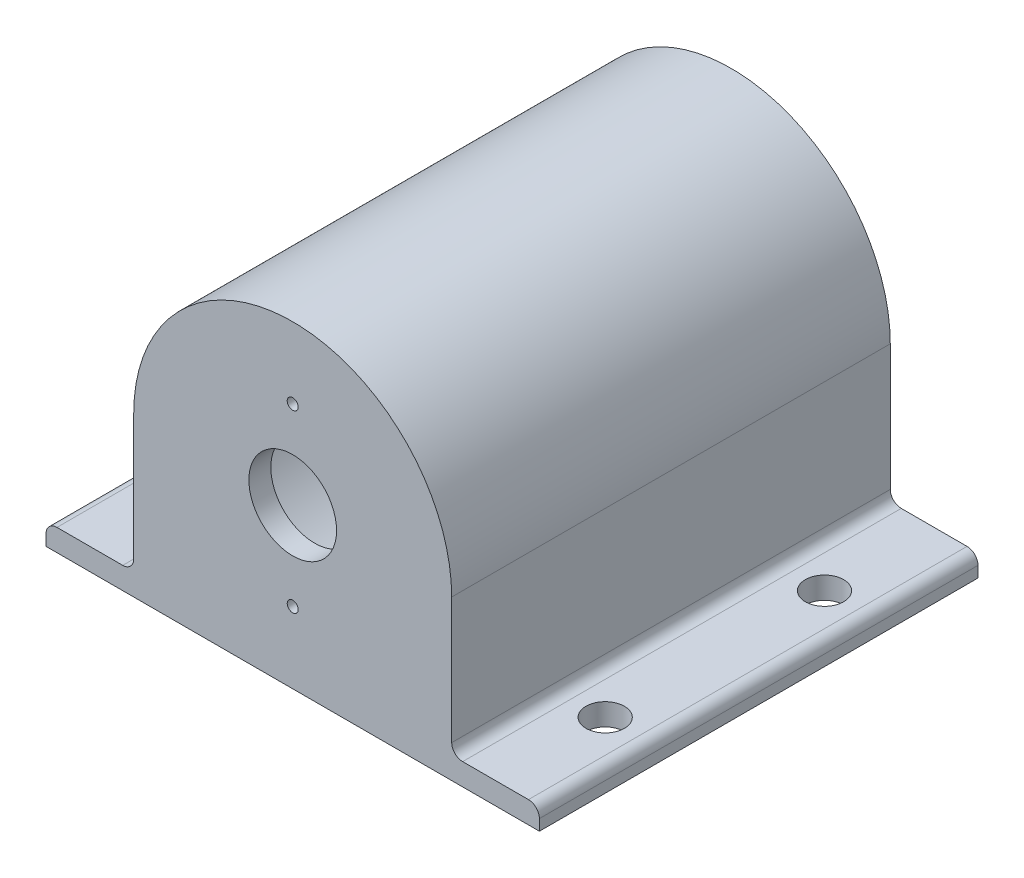
ISO-10303-21;
HEADER;
FILE_DESCRIPTION(('STEP AP214'),'2;1');
FILE_NAME('part.step','',(''),(''),'','','');
FILE_SCHEMA(('AUTOMOTIVE_DESIGN { 1 0 10303 214 1 1 1 1 }'));
ENDSEC;
DATA;
#1=APPLICATION_CONTEXT('core data for automotive mechanical design processes');
#2=APPLICATION_PROTOCOL_DEFINITION('international standard','automotive_design',2000,#1);
#3=PRODUCT_CONTEXT('',#1,'mechanical');
#4=PRODUCT('Part','Part','',(#3));
#5=PRODUCT_RELATED_PRODUCT_CATEGORY('part','',(#4));
#6=PRODUCT_DEFINITION_FORMATION('','',#4);
#7=PRODUCT_DEFINITION_CONTEXT('part definition',#1,'design');
#8=PRODUCT_DEFINITION('design','',#6,#7);
#9=PRODUCT_DEFINITION_SHAPE('','',#8);
#10=(LENGTH_UNIT() NAMED_UNIT(*) SI_UNIT(.MILLI.,.METRE.));
#11=(NAMED_UNIT(*) PLANE_ANGLE_UNIT() SI_UNIT($,.RADIAN.));
#12=(NAMED_UNIT(*) SI_UNIT($,.STERADIAN.) SOLID_ANGLE_UNIT());
#13=UNCERTAINTY_MEASURE_WITH_UNIT(LENGTH_MEASURE(1.E-05),#10,'distance_accuracy_value','');
#14=(GEOMETRIC_REPRESENTATION_CONTEXT(3) GLOBAL_UNCERTAINTY_ASSIGNED_CONTEXT((#13)) GLOBAL_UNIT_ASSIGNED_CONTEXT((#10,
#11,#12)) REPRESENTATION_CONTEXT('',''));
#15=CARTESIAN_POINT('',(0.,0.,0.));
#16=DIRECTION('',(0.,0.,1.));
#17=DIRECTION('',(1.,0.,0.));
#18=AXIS2_PLACEMENT_3D('',#15,#16,#17);
#19=CARTESIAN_POINT('',(-22.5,-14.5,0.));
#20=DIRECTION('',(0.,-1.,0.));
#21=DIRECTION('',(0.,0.,-1.));
#22=AXIS2_PLACEMENT_3D('',#19,#20,#21);
#23=PLANE('',#22);
#24=CARTESIAN_POINT('',(18.5,-14.5,30.));
#25=DIRECTION('',(0.,1.,0.));
#26=DIRECTION('',(-1.,0.,0.));
#27=AXIS2_PLACEMENT_3D('',#24,#25,#26);
#28=CIRCLE('',#27,1.75);
#29=CARTESIAN_POINT('',(16.75,-14.5,30.));
#30=VERTEX_POINT('',#29);
#31=EDGE_CURVE('E510',#30,#30,#28,.F.);
#32=ORIENTED_EDGE('',*,*,#31,.F.);
#33=EDGE_LOOP('',(#32));
#34=FACE_BOUND('',#33,.T.);
#35=CARTESIAN_POINT('',(-18.5,-14.5,30.));
#36=DIRECTION('',(0.,1.,0.));
#37=DIRECTION('',(-1.,0.,0.));
#38=AXIS2_PLACEMENT_3D('',#35,#36,#37);
#39=CIRCLE('',#38,1.75);
#40=CARTESIAN_POINT('',(-20.25,-14.5,30.));
#41=VERTEX_POINT('',#40);
#42=EDGE_CURVE('E502',#41,#41,#39,.T.);
#43=ORIENTED_EDGE('',*,*,#42,.T.);
#44=EDGE_LOOP('',(#43));
#45=FACE_BOUND('',#44,.T.);
#46=CARTESIAN_POINT('',(-18.5,-14.5,10.));
#47=DIRECTION('',(0.,1.,0.));
#48=DIRECTION('',(-1.,0.,0.));
#49=AXIS2_PLACEMENT_3D('',#46,#47,#48);
#50=CIRCLE('',#49,1.75);
#51=CARTESIAN_POINT('',(-20.25,-14.5,10.));
#52=VERTEX_POINT('',#51);
#53=EDGE_CURVE('E172',#52,#52,#50,.T.);
#54=ORIENTED_EDGE('',*,*,#53,.T.);
#55=EDGE_LOOP('',(#54));
#56=FACE_BOUND('',#55,.T.);
#57=DIRECTION('',(1.,0.,0.));
#58=VECTOR('',#57,1.);
#59=CARTESIAN_POINT('',(-22.5,-14.5,40.));
#60=LINE('',#59,#58);
#61=CARTESIAN_POINT('',(-22.5,-14.5,40.));
#62=VERTEX_POINT('',#61);
#63=CARTESIAN_POINT('',(22.5,-14.5,40.));
#64=VERTEX_POINT('',#63);
#65=EDGE_CURVE('E158',#62,#64,#60,.T.);
#66=ORIENTED_EDGE('',*,*,#65,.F.);
#67=DIRECTION('',(0.,0.,1.));
#68=VECTOR('',#67,1.);
#69=CARTESIAN_POINT('',(-22.5,-14.5,0.));
#70=LINE('',#69,#68);
#71=CARTESIAN_POINT('',(-22.5,-14.5,0.));
#72=VERTEX_POINT('',#71);
#73=EDGE_CURVE('E146',#72,#62,#70,.T.);
#74=ORIENTED_EDGE('',*,*,#73,.F.);
#75=DIRECTION('',(1.,0.,0.));
#76=VECTOR('',#75,1.);
#77=CARTESIAN_POINT('',(-22.5,-14.5,0.));
#78=LINE('',#77,#76);
#79=CARTESIAN_POINT('',(22.5,-14.5,0.));
#80=VERTEX_POINT('',#79);
#81=EDGE_CURVE('E151',#72,#80,#78,.T.);
#82=ORIENTED_EDGE('',*,*,#81,.T.);
#83=DIRECTION('',(0.,0.,1.));
#84=VECTOR('',#83,1.);
#85=CARTESIAN_POINT('',(22.5,-14.5,0.));
#86=LINE('',#85,#84);
#87=EDGE_CURVE('E159',#80,#64,#86,.T.);
#88=ORIENTED_EDGE('',*,*,#87,.T.);
#89=EDGE_LOOP('',(#66,#74,#82,#88));
#90=FACE_BOUND('',#89,.T.);
#91=CARTESIAN_POINT('',(18.5,-14.5,10.));
#92=DIRECTION('',(0.,1.,0.));
#93=DIRECTION('',(-1.,0.,0.));
#94=AXIS2_PLACEMENT_3D('',#91,#92,#93);
#95=CIRCLE('',#94,1.75);
#96=CARTESIAN_POINT('',(16.75,-14.5,10.));
#97=VERTEX_POINT('',#96);
#98=EDGE_CURVE('E489',#97,#97,#95,.F.);
#99=ORIENTED_EDGE('',*,*,#98,.F.);
#100=EDGE_LOOP('',(#99));
#101=FACE_BOUND('',#100,.T.);
#102=ADVANCED_FACE('F56',(#34,#45,#56,#90,#101),#23,.T.);
#103=CARTESIAN_POINT('',(0.,0.,40.));
#104=DIRECTION('',(0.,0.,-1.));
#105=DIRECTION('',(-1.,0.,0.));
#106=AXIS2_PLACEMENT_3D('',#103,#104,#105);
#107=CYLINDRICAL_SURFACE('',#106,12.5);
#108=CARTESIAN_POINT('',(0.,0.,38.));
#109=DIRECTION('',(0.,0.,1.));
#110=DIRECTION('',(1.,0.,0.));
#111=AXIS2_PLACEMENT_3D('',#108,#109,#110);
#112=CIRCLE('',#111,12.5);
#113=CARTESIAN_POINT('',(12.5,0.,38.));
#114=VERTEX_POINT('',#113);
#115=EDGE_CURVE('E190',#114,#114,#112,.F.);
#116=ORIENTED_EDGE('',*,*,#115,.F.);
#117=EDGE_LOOP('',(#116));
#118=FACE_BOUND('',#117,.T.);
#119=CARTESIAN_POINT('',(0.,0.,0.));
#120=DIRECTION('',(0.,0.,1.));
#121=DIRECTION('',(1.,0.,0.));
#122=AXIS2_PLACEMENT_3D('',#119,#120,#121);
#123=CIRCLE('',#122,12.5);
#124=CARTESIAN_POINT('',(12.5,0.,0.));
#125=VERTEX_POINT('',#124);
#126=EDGE_CURVE('E213',#125,#125,#123,.T.);
#127=ORIENTED_EDGE('',*,*,#126,.F.);
#128=EDGE_LOOP('',(#127));
#129=FACE_BOUND('',#128,.T.);
#130=ADVANCED_FACE('F310',(#118,#129),#107,.F.);
#131=CARTESIAN_POINT('',(0.,0.,40.));
#132=DIRECTION('',(0.,0.,-1.));
#133=DIRECTION('',(-1.,0.,0.));
#134=AXIS2_PLACEMENT_3D('',#131,#132,#133);
#135=CYLINDRICAL_SURFACE('',#134,14.5);
#136=CARTESIAN_POINT('',(0.,0.,0.));
#137=DIRECTION('',(0.,0.,1.));
#138=DIRECTION('',(1.,0.,0.));
#139=AXIS2_PLACEMENT_3D('',#136,#137,#138);
#140=CIRCLE('',#139,14.5);
#141=CARTESIAN_POINT('',(14.5,0.,0.));
#142=VERTEX_POINT('',#141);
#143=CARTESIAN_POINT('',(-14.5,0.,0.));
#144=VERTEX_POINT('',#143);
#145=EDGE_CURVE('E208',#142,#144,#140,.T.);
#146=ORIENTED_EDGE('',*,*,#145,.T.);
#147=DIRECTION('',(0.,0.,-1.));
#148=VECTOR('',#147,1.);
#149=CARTESIAN_POINT('',(-14.5,0.,40.));
#150=LINE('',#149,#148);
#151=CARTESIAN_POINT('',(-14.5,0.,40.));
#152=VERTEX_POINT('',#151);
#153=EDGE_CURVE('E212',#152,#144,#150,.T.);
#154=ORIENTED_EDGE('',*,*,#153,.F.);
#155=CARTESIAN_POINT('',(0.,0.,40.));
#156=DIRECTION('',(0.,0.,1.));
#157=DIRECTION('',(1.,0.,0.));
#158=AXIS2_PLACEMENT_3D('',#155,#156,#157);
#159=CIRCLE('',#158,14.5);
#160=CARTESIAN_POINT('',(14.5,0.,40.));
#161=VERTEX_POINT('',#160);
#162=EDGE_CURVE('E209',#161,#152,#159,.T.);
#163=ORIENTED_EDGE('',*,*,#162,.F.);
#164=DIRECTION('',(0.,0.,-1.));
#165=VECTOR('',#164,1.);
#166=CARTESIAN_POINT('',(14.5,0.,40.));
#167=LINE('',#166,#165);
#168=EDGE_CURVE('E220',#161,#142,#167,.T.);
#169=ORIENTED_EDGE('',*,*,#168,.T.);
#170=EDGE_LOOP('',(#146,#154,#163,#169));
#171=FACE_BOUND('',#170,.T.);
#172=ADVANCED_FACE('F278',(#171),#135,.T.);
#173=CARTESIAN_POINT('',(0.,0.,40.));
#174=DIRECTION('',(0.,0.,1.));
#175=DIRECTION('',(1.,0.,0.));
#176=AXIS2_PLACEMENT_3D('',#173,#174,#175);
#177=PLANE('',#176);
#178=CARTESIAN_POINT('',(0.,8.,40.));
#179=DIRECTION('',(0.,0.,1.));
#180=DIRECTION('',(1.,0.,0.));
#181=AXIS2_PLACEMENT_3D('',#178,#179,#180);
#182=CIRCLE('',#181,0.5);
#183=CARTESIAN_POINT('',(0.5,8.,40.));
#184=VERTEX_POINT('',#183);
#185=EDGE_CURVE('E184',#184,#184,#182,.T.);
#186=ORIENTED_EDGE('',*,*,#185,.F.);
#187=EDGE_LOOP('',(#186));
#188=FACE_BOUND('',#187,.T.);
#189=CARTESIAN_POINT('',(0.,-8.,40.));
#190=DIRECTION('',(0.,0.,1.));
#191=DIRECTION('',(1.,0.,0.));
#192=AXIS2_PLACEMENT_3D('',#189,#190,#191);
#193=CIRCLE('',#192,0.5);
#194=CARTESIAN_POINT('',(0.5,-8.,40.));
#195=VERTEX_POINT('',#194);
#196=EDGE_CURVE('E182',#195,#195,#193,.T.);
#197=ORIENTED_EDGE('',*,*,#196,.F.);
#198=EDGE_LOOP('',(#197));
#199=FACE_BOUND('',#198,.T.);
#200=DIRECTION('',(0.,1.,0.));
#201=VECTOR('',#200,1.);
#202=CARTESIAN_POINT('',(22.5,-14.5,40.));
#203=LINE('',#202,#201);
#204=CARTESIAN_POINT('',(22.5,-13.5,40.));
#205=VERTEX_POINT('',#204);
#206=EDGE_CURVE('E174',#64,#205,#203,.T.);
#207=ORIENTED_EDGE('',*,*,#206,.T.);
#208=CARTESIAN_POINT('',(21.5,-13.5,40.));
#209=DIRECTION('',(0.,0.,1.));
#210=DIRECTION('',(1.,0.,0.));
#211=AXIS2_PLACEMENT_3D('',#208,#209,#210);
#212=CIRCLE('',#211,1.);
#213=CARTESIAN_POINT('',(21.5,-12.5,40.));
#214=VERTEX_POINT('',#213);
#215=EDGE_CURVE('E232',#205,#214,#212,.T.);
#216=ORIENTED_EDGE('',*,*,#215,.T.);
#217=DIRECTION('',(-1.,0.,0.));
#218=VECTOR('',#217,1.);
#219=CARTESIAN_POINT('',(22.5,-12.5,40.));
#220=LINE('',#219,#218);
#221=CARTESIAN_POINT('',(15.5,-12.5,40.));
#222=VERTEX_POINT('',#221);
#223=EDGE_CURVE('E178',#214,#222,#220,.T.);
#224=ORIENTED_EDGE('',*,*,#223,.T.);
#225=CARTESIAN_POINT('',(15.5,-11.5,40.));
#226=DIRECTION('',(0.,0.,1.));
#227=DIRECTION('',(1.,0.,0.));
#228=AXIS2_PLACEMENT_3D('',#225,#226,#227);
#229=CIRCLE('',#228,1.);
#230=CARTESIAN_POINT('',(14.5,-11.5,40.));
#231=VERTEX_POINT('',#230);
#232=EDGE_CURVE('E253',#222,#231,#229,.F.);
#233=ORIENTED_EDGE('',*,*,#232,.T.);
#234=DIRECTION('',(0.,1.,0.));
#235=VECTOR('',#234,1.);
#236=CARTESIAN_POINT('',(14.5,-12.5,40.));
#237=LINE('',#236,#235);
#238=EDGE_CURVE('E202',#231,#161,#237,.T.);
#239=ORIENTED_EDGE('',*,*,#238,.T.);
#240=ORIENTED_EDGE('',*,*,#162,.T.);
#241=DIRECTION('',(0.,1.,0.));
#242=VECTOR('',#241,1.);
#243=CARTESIAN_POINT('',(-14.5,-12.5,40.));
#244=LINE('',#243,#242);
#245=CARTESIAN_POINT('',(-14.5,-11.5,40.));
#246=VERTEX_POINT('',#245);
#247=EDGE_CURVE('E204',#246,#152,#244,.T.);
#248=ORIENTED_EDGE('',*,*,#247,.F.);
#249=CARTESIAN_POINT('',(-15.5,-11.5,40.));
#250=DIRECTION('',(0.,0.,1.));
#251=DIRECTION('',(1.,0.,0.));
#252=AXIS2_PLACEMENT_3D('',#249,#250,#251);
#253=CIRCLE('',#252,1.);
#254=CARTESIAN_POINT('',(-15.5,-12.5,40.));
#255=VERTEX_POINT('',#254);
#256=EDGE_CURVE('E12',#246,#255,#253,.F.);
#257=ORIENTED_EDGE('',*,*,#256,.T.);
#258=CARTESIAN_POINT('',(-21.5,-12.5,40.));
#259=VERTEX_POINT('',#258);
#260=EDGE_CURVE('E177',#255,#259,#220,.T.);
#261=ORIENTED_EDGE('',*,*,#260,.T.);
#262=CARTESIAN_POINT('',(-21.5,-13.5,40.));
#263=DIRECTION('',(0.,0.,1.));
#264=DIRECTION('',(1.,0.,0.));
#265=AXIS2_PLACEMENT_3D('',#262,#263,#264);
#266=CIRCLE('',#265,1.);
#267=CARTESIAN_POINT('',(-22.5,-13.5,40.));
#268=VERTEX_POINT('',#267);
#269=EDGE_CURVE('E230',#259,#268,#266,.T.);
#270=ORIENTED_EDGE('',*,*,#269,.T.);
#271=DIRECTION('',(0.,-1.,0.));
#272=VECTOR('',#271,1.);
#273=CARTESIAN_POINT('',(-22.5,-12.5,40.));
#274=LINE('',#273,#272);
#275=EDGE_CURVE('E170',#268,#62,#274,.T.);
#276=ORIENTED_EDGE('',*,*,#275,.T.);
#277=ORIENTED_EDGE('',*,*,#65,.T.);
#278=EDGE_LOOP('',(#207,#216,#224,#233,#239,#240,#248,#257,#261,#270,#276,#277));
#279=FACE_BOUND('',#278,.T.);
#280=CARTESIAN_POINT('',(0.,0.,40.));
#281=DIRECTION('',(0.,0.,1.));
#282=DIRECTION('',(1.,0.,0.));
#283=AXIS2_PLACEMENT_3D('',#280,#281,#282);
#284=CIRCLE('',#283,4.);
#285=CARTESIAN_POINT('',(4.,0.,40.));
#286=VERTEX_POINT('',#285);
#287=EDGE_CURVE('E194',#286,#286,#284,.T.);
#288=ORIENTED_EDGE('',*,*,#287,.F.);
#289=EDGE_LOOP('',(#288));
#290=FACE_BOUND('',#289,.T.);
#291=ADVANCED_FACE('F271',(#188,#199,#279,#290),#177,.T.);
#292=CARTESIAN_POINT('',(0.,0.,0.));
#293=DIRECTION('',(0.,0.,1.));
#294=DIRECTION('',(1.,0.,0.));
#295=AXIS2_PLACEMENT_3D('',#292,#293,#294);
#296=PLANE('',#295);
#297=ORIENTED_EDGE('',*,*,#126,.T.);
#298=EDGE_LOOP('',(#297));
#299=FACE_BOUND('',#298,.T.);
#300=DIRECTION('',(-1.,0.,0.));
#301=VECTOR('',#300,1.);
#302=CARTESIAN_POINT('',(14.5,-12.5,0.));
#303=LINE('',#302,#301);
#304=CARTESIAN_POINT('',(21.5,-12.5,0.));
#305=VERTEX_POINT('',#304);
#306=CARTESIAN_POINT('',(15.5,-12.5,0.));
#307=VERTEX_POINT('',#306);
#308=EDGE_CURVE('E152',#305,#307,#303,.T.);
#309=ORIENTED_EDGE('',*,*,#308,.F.);
#310=CARTESIAN_POINT('',(21.5,-13.5,0.));
#311=DIRECTION('',(0.,0.,1.));
#312=DIRECTION('',(1.,0.,0.));
#313=AXIS2_PLACEMENT_3D('',#310,#311,#312);
#314=CIRCLE('',#313,1.);
#315=CARTESIAN_POINT('',(22.5,-13.5,0.));
#316=VERTEX_POINT('',#315);
#317=EDGE_CURVE('E240',#305,#316,#314,.F.);
#318=ORIENTED_EDGE('',*,*,#317,.T.);
#319=DIRECTION('',(0.,1.,0.));
#320=VECTOR('',#319,1.);
#321=CARTESIAN_POINT('',(22.5,-14.5,0.));
#322=LINE('',#321,#320);
#323=EDGE_CURVE('E160',#80,#316,#322,.T.);
#324=ORIENTED_EDGE('',*,*,#323,.F.);
#325=ORIENTED_EDGE('',*,*,#81,.F.);
#326=DIRECTION('',(0.,-1.,0.));
#327=VECTOR('',#326,1.);
#328=CARTESIAN_POINT('',(-22.5,-12.5,0.));
#329=LINE('',#328,#327);
#330=CARTESIAN_POINT('',(-22.5,-13.5,0.));
#331=VERTEX_POINT('',#330);
#332=EDGE_CURVE('E142',#331,#72,#329,.T.);
#333=ORIENTED_EDGE('',*,*,#332,.F.);
#334=CARTESIAN_POINT('',(-21.5,-13.5,0.));
#335=DIRECTION('',(0.,0.,1.));
#336=DIRECTION('',(1.,0.,0.));
#337=AXIS2_PLACEMENT_3D('',#334,#335,#336);
#338=CIRCLE('',#337,1.);
#339=CARTESIAN_POINT('',(-21.5,-12.5,0.));
#340=VERTEX_POINT('',#339);
#341=EDGE_CURVE('E76',#331,#340,#338,.F.);
#342=ORIENTED_EDGE('',*,*,#341,.T.);
#343=CARTESIAN_POINT('',(-15.5,-12.5,0.));
#344=VERTEX_POINT('',#343);
#345=EDGE_CURVE('E181',#344,#340,#303,.T.);
#346=ORIENTED_EDGE('',*,*,#345,.F.);
#347=CARTESIAN_POINT('',(-15.5,-11.5,0.));
#348=DIRECTION('',(0.,0.,1.));
#349=DIRECTION('',(1.,0.,0.));
#350=AXIS2_PLACEMENT_3D('',#347,#348,#349);
#351=CIRCLE('',#350,1.);
#352=CARTESIAN_POINT('',(-14.5,-11.5,0.));
#353=VERTEX_POINT('',#352);
#354=EDGE_CURVE('E64',#344,#353,#351,.T.);
#355=ORIENTED_EDGE('',*,*,#354,.T.);
#356=DIRECTION('',(0.,1.,0.));
#357=VECTOR('',#356,1.);
#358=CARTESIAN_POINT('',(-14.5,-12.5,0.));
#359=LINE('',#358,#357);
#360=EDGE_CURVE('E206',#353,#144,#359,.T.);
#361=ORIENTED_EDGE('',*,*,#360,.T.);
#362=ORIENTED_EDGE('',*,*,#145,.F.);
#363=DIRECTION('',(0.,1.,0.));
#364=VECTOR('',#363,1.);
#365=CARTESIAN_POINT('',(14.5,-12.5,0.));
#366=LINE('',#365,#364);
#367=CARTESIAN_POINT('',(14.5,-11.5,0.));
#368=VERTEX_POINT('',#367);
#369=EDGE_CURVE('E197',#368,#142,#366,.T.);
#370=ORIENTED_EDGE('',*,*,#369,.F.);
#371=CARTESIAN_POINT('',(15.5,-11.5,0.));
#372=DIRECTION('',(0.,0.,1.));
#373=DIRECTION('',(1.,0.,0.));
#374=AXIS2_PLACEMENT_3D('',#371,#372,#373);
#375=CIRCLE('',#374,1.);
#376=EDGE_CURVE('E255',#368,#307,#375,.T.);
#377=ORIENTED_EDGE('',*,*,#376,.T.);
#378=EDGE_LOOP('',(#309,#318,#324,#325,#333,#342,#346,#355,#361,#362,#370,#377));
#379=FACE_BOUND('',#378,.T.);
#380=ADVANCED_FACE('F164',(#299,#379),#296,.F.);
#381=CARTESIAN_POINT('',(-14.5,-12.5,40.));
#382=DIRECTION('',(1.,0.,0.));
#383=DIRECTION('',(0.,0.,-1.));
#384=AXIS2_PLACEMENT_3D('',#381,#382,#383);
#385=PLANE('',#384);
#386=ORIENTED_EDGE('',*,*,#360,.F.);
#387=DIRECTION('',(0.,0.,-1.));
#388=VECTOR('',#387,1.);
#389=CARTESIAN_POINT('',(-14.5,-11.5,40.));
#390=LINE('',#389,#388);
#391=EDGE_CURVE('E251',#353,#246,#390,.F.);
#392=ORIENTED_EDGE('',*,*,#391,.T.);
#393=ORIENTED_EDGE('',*,*,#247,.T.);
#394=ORIENTED_EDGE('',*,*,#153,.T.);
#395=EDGE_LOOP('',(#386,#392,#393,#394));
#396=FACE_BOUND('',#395,.T.);
#397=ADVANCED_FACE('F282',(#396),#385,.F.);
#398=CARTESIAN_POINT('',(14.5,-12.5,0.));
#399=DIRECTION('',(-1.,0.,0.));
#400=DIRECTION('',(0.,0.,1.));
#401=AXIS2_PLACEMENT_3D('',#398,#399,#400);
#402=PLANE('',#401);
#403=ORIENTED_EDGE('',*,*,#238,.F.);
#404=DIRECTION('',(0.,0.,1.));
#405=VECTOR('',#404,1.);
#406=CARTESIAN_POINT('',(14.5,-11.5,0.));
#407=LINE('',#406,#405);
#408=EDGE_CURVE('E242',#231,#368,#407,.F.);
#409=ORIENTED_EDGE('',*,*,#408,.T.);
#410=ORIENTED_EDGE('',*,*,#369,.T.);
#411=ORIENTED_EDGE('',*,*,#168,.F.);
#412=EDGE_LOOP('',(#403,#409,#410,#411));
#413=FACE_BOUND('',#412,.T.);
#414=ADVANCED_FACE('F276',(#413),#402,.F.);
#415=CARTESIAN_POINT('',(0.,0.,38.));
#416=DIRECTION('',(0.,0.,1.));
#417=DIRECTION('',(1.,0.,0.));
#418=AXIS2_PLACEMENT_3D('',#415,#416,#417);
#419=CYLINDRICAL_SURFACE('',#418,4.);
#420=CARTESIAN_POINT('',(0.,0.,38.));
#421=DIRECTION('',(0.,0.,1.));
#422=DIRECTION('',(1.,0.,0.));
#423=AXIS2_PLACEMENT_3D('',#420,#421,#422);
#424=CIRCLE('',#423,4.);
#425=CARTESIAN_POINT('',(4.,0.,38.));
#426=VERTEX_POINT('',#425);
#427=EDGE_CURVE('E193',#426,#426,#424,.T.);
#428=ORIENTED_EDGE('',*,*,#427,.F.);
#429=EDGE_LOOP('',(#428));
#430=FACE_BOUND('',#429,.T.);
#431=ORIENTED_EDGE('',*,*,#287,.T.);
#432=EDGE_LOOP('',(#431));
#433=FACE_BOUND('',#432,.T.);
#434=ADVANCED_FACE('F336',(#430,#433),#419,.F.);
#435=CARTESIAN_POINT('',(0.,0.,38.));
#436=DIRECTION('',(0.,0.,1.));
#437=DIRECTION('',(1.,0.,0.));
#438=AXIS2_PLACEMENT_3D('',#435,#436,#437);
#439=PLANE('',#438);
#440=CARTESIAN_POINT('',(0.,8.,38.));
#441=DIRECTION('',(0.,0.,1.));
#442=DIRECTION('',(1.,0.,0.));
#443=AXIS2_PLACEMENT_3D('',#440,#441,#442);
#444=CIRCLE('',#443,0.5);
#445=CARTESIAN_POINT('',(0.5,8.,38.));
#446=VERTEX_POINT('',#445);
#447=EDGE_CURVE('E200',#446,#446,#444,.T.);
#448=ORIENTED_EDGE('',*,*,#447,.T.);
#449=EDGE_LOOP('',(#448));
#450=FACE_BOUND('',#449,.T.);
#451=CARTESIAN_POINT('',(0.,-8.,38.));
#452=DIRECTION('',(0.,0.,1.));
#453=DIRECTION('',(1.,0.,0.));
#454=AXIS2_PLACEMENT_3D('',#451,#452,#453);
#455=CIRCLE('',#454,0.5);
#456=CARTESIAN_POINT('',(0.5,-8.,38.));
#457=VERTEX_POINT('',#456);
#458=EDGE_CURVE('E187',#457,#457,#455,.T.);
#459=ORIENTED_EDGE('',*,*,#458,.T.);
#460=EDGE_LOOP('',(#459));
#461=FACE_BOUND('',#460,.T.);
#462=ORIENTED_EDGE('',*,*,#115,.T.);
#463=EDGE_LOOP('',(#462));
#464=FACE_BOUND('',#463,.T.);
#465=ORIENTED_EDGE('',*,*,#427,.T.);
#466=EDGE_LOOP('',(#465));
#467=FACE_BOUND('',#466,.T.);
#468=ADVANCED_FACE('F332',(#450,#461,#464,#467),#439,.F.);
#469=CARTESIAN_POINT('',(0.,-8.,0.));
#470=DIRECTION('',(0.,0.,1.));
#471=DIRECTION('',(1.,0.,0.));
#472=AXIS2_PLACEMENT_3D('',#469,#470,#471);
#473=CYLINDRICAL_SURFACE('',#472,0.5);
#474=ORIENTED_EDGE('',*,*,#196,.T.);
#475=EDGE_LOOP('',(#474));
#476=FACE_BOUND('',#475,.T.);
#477=ORIENTED_EDGE('',*,*,#458,.F.);
#478=EDGE_LOOP('',(#477));
#479=FACE_BOUND('',#478,.T.);
#480=ADVANCED_FACE('F328',(#476,#479),#473,.F.);
#481=CARTESIAN_POINT('',(0.,8.,0.));
#482=DIRECTION('',(0.,0.,1.));
#483=DIRECTION('',(1.,0.,0.));
#484=AXIS2_PLACEMENT_3D('',#481,#482,#483);
#485=CYLINDRICAL_SURFACE('',#484,0.5);
#486=ORIENTED_EDGE('',*,*,#185,.T.);
#487=EDGE_LOOP('',(#486));
#488=FACE_BOUND('',#487,.T.);
#489=ORIENTED_EDGE('',*,*,#447,.F.);
#490=EDGE_LOOP('',(#489));
#491=FACE_BOUND('',#490,.T.);
#492=ADVANCED_FACE('F325',(#488,#491),#485,.F.);
#493=CARTESIAN_POINT('',(22.5,-12.5,0.));
#494=DIRECTION('',(0.,1.,0.));
#495=DIRECTION('',(-1.,0.,0.));
#496=AXIS2_PLACEMENT_3D('',#493,#494,#495);
#497=PLANE('',#496);
#498=CARTESIAN_POINT('',(-18.5,-12.5,30.));
#499=DIRECTION('',(0.,1.,0.));
#500=DIRECTION('',(-1.,0.,0.));
#501=AXIS2_PLACEMENT_3D('',#498,#499,#500);
#502=CIRCLE('',#501,1.75);
#503=CARTESIAN_POINT('',(-20.25,-12.5,30.));
#504=VERTEX_POINT('',#503);
#505=EDGE_CURVE('E506',#504,#504,#502,.T.);
#506=ORIENTED_EDGE('',*,*,#505,.F.);
#507=EDGE_LOOP('',(#506));
#508=FACE_BOUND('',#507,.T.);
#509=CARTESIAN_POINT('',(-18.5,-12.5,10.));
#510=DIRECTION('',(0.,1.,0.));
#511=DIRECTION('',(-1.,0.,0.));
#512=AXIS2_PLACEMENT_3D('',#509,#510,#511);
#513=CIRCLE('',#512,1.75);
#514=CARTESIAN_POINT('',(-20.25,-12.5,10.));
#515=VERTEX_POINT('',#514);
#516=EDGE_CURVE('E500',#515,#515,#513,.T.);
#517=ORIENTED_EDGE('',*,*,#516,.F.);
#518=EDGE_LOOP('',(#517));
#519=FACE_BOUND('',#518,.T.);
#520=ORIENTED_EDGE('',*,*,#345,.T.);
#521=DIRECTION('',(0.,0.,1.));
#522=VECTOR('',#521,1.);
#523=CARTESIAN_POINT('',(-21.5,-12.5,0.));
#524=LINE('',#523,#522);
#525=EDGE_CURVE('E247',#340,#259,#524,.T.);
#526=ORIENTED_EDGE('',*,*,#525,.T.);
#527=ORIENTED_EDGE('',*,*,#260,.F.);
#528=DIRECTION('',(0.,0.,-1.));
#529=VECTOR('',#528,1.);
#530=CARTESIAN_POINT('',(-15.5,-12.5,0.));
#531=LINE('',#530,#529);
#532=EDGE_CURVE('E244',#255,#344,#531,.T.);
#533=ORIENTED_EDGE('',*,*,#532,.T.);
#534=EDGE_LOOP('',(#520,#526,#527,#533));
#535=FACE_BOUND('',#534,.T.);
#536=ADVANCED_FACE('F290',(#508,#519,#535),#497,.T.);
#537=CARTESIAN_POINT('',(18.5,-12.5,10.));
#538=DIRECTION('',(0.,1.,0.));
#539=DIRECTION('',(-1.,0.,0.));
#540=AXIS2_PLACEMENT_3D('',#537,#538,#539);
#541=CIRCLE('',#540,1.75);
#542=CARTESIAN_POINT('',(16.75,-12.5,10.));
#543=VERTEX_POINT('',#542);
#544=EDGE_CURVE('E492',#543,#543,#541,.F.);
#545=ORIENTED_EDGE('',*,*,#544,.T.);
#546=EDGE_LOOP('',(#545));
#547=FACE_BOUND('',#546,.T.);
#548=CARTESIAN_POINT('',(18.5,-12.5,30.));
#549=DIRECTION('',(0.,1.,0.));
#550=DIRECTION('',(-1.,0.,0.));
#551=AXIS2_PLACEMENT_3D('',#548,#549,#550);
#552=CIRCLE('',#551,1.75);
#553=CARTESIAN_POINT('',(16.75,-12.5,30.));
#554=VERTEX_POINT('',#553);
#555=EDGE_CURVE('E494',#554,#554,#552,.F.);
#556=ORIENTED_EDGE('',*,*,#555,.T.);
#557=EDGE_LOOP('',(#556));
#558=FACE_BOUND('',#557,.T.);
#559=ORIENTED_EDGE('',*,*,#223,.F.);
#560=DIRECTION('',(0.,0.,1.));
#561=VECTOR('',#560,1.);
#562=CARTESIAN_POINT('',(21.5,-12.5,0.));
#563=LINE('',#562,#561);
#564=EDGE_CURVE('E237',#214,#305,#563,.F.);
#565=ORIENTED_EDGE('',*,*,#564,.T.);
#566=ORIENTED_EDGE('',*,*,#308,.T.);
#567=DIRECTION('',(0.,0.,1.));
#568=VECTOR('',#567,1.);
#569=CARTESIAN_POINT('',(15.5,-12.5,0.));
#570=LINE('',#569,#568);
#571=EDGE_CURVE('E234',#307,#222,#570,.T.);
#572=ORIENTED_EDGE('',*,*,#571,.T.);
#573=EDGE_LOOP('',(#559,#565,#566,#572));
#574=FACE_BOUND('',#573,.T.);
#575=ADVANCED_FACE('F266',(#547,#558,#574),#497,.T.);
#576=CARTESIAN_POINT('',(22.5,-14.5,0.));
#577=DIRECTION('',(1.,0.,0.));
#578=DIRECTION('',(0.,0.,-1.));
#579=AXIS2_PLACEMENT_3D('',#576,#577,#578);
#580=PLANE('',#579);
#581=ORIENTED_EDGE('',*,*,#323,.T.);
#582=DIRECTION('',(0.,0.,1.));
#583=VECTOR('',#582,1.);
#584=CARTESIAN_POINT('',(22.5,-13.5,0.));
#585=LINE('',#584,#583);
#586=EDGE_CURVE('E223',#316,#205,#585,.T.);
#587=ORIENTED_EDGE('',*,*,#586,.T.);
#588=ORIENTED_EDGE('',*,*,#206,.F.);
#589=ORIENTED_EDGE('',*,*,#87,.F.);
#590=EDGE_LOOP('',(#581,#587,#588,#589));
#591=FACE_BOUND('',#590,.T.);
#592=ADVANCED_FACE('F296',(#591),#580,.T.);
#593=CARTESIAN_POINT('',(-22.5,-12.5,0.));
#594=DIRECTION('',(-1.,0.,0.));
#595=DIRECTION('',(0.,0.,1.));
#596=AXIS2_PLACEMENT_3D('',#593,#594,#595);
#597=PLANE('',#596);
#598=ORIENTED_EDGE('',*,*,#275,.F.);
#599=DIRECTION('',(0.,0.,1.));
#600=VECTOR('',#599,1.);
#601=CARTESIAN_POINT('',(-22.5,-13.5,0.));
#602=LINE('',#601,#600);
#603=EDGE_CURVE('E149',#268,#331,#602,.F.);
#604=ORIENTED_EDGE('',*,*,#603,.T.);
#605=ORIENTED_EDGE('',*,*,#332,.T.);
#606=ORIENTED_EDGE('',*,*,#73,.T.);
#607=EDGE_LOOP('',(#598,#604,#605,#606));
#608=FACE_BOUND('',#607,.T.);
#609=ADVANCED_FACE('F145',(#608),#597,.T.);
#610=CARTESIAN_POINT('',(21.5,-13.5,0.));
#611=DIRECTION('',(0.,0.,1.));
#612=DIRECTION('',(1.,0.,0.));
#613=AXIS2_PLACEMENT_3D('',#610,#611,#612);
#614=CYLINDRICAL_SURFACE('',#613,1.);
#615=ORIENTED_EDGE('',*,*,#317,.F.);
#616=ORIENTED_EDGE('',*,*,#564,.F.);
#617=ORIENTED_EDGE('',*,*,#215,.F.);
#618=ORIENTED_EDGE('',*,*,#586,.F.);
#619=EDGE_LOOP('',(#615,#616,#617,#618));
#620=FACE_BOUND('',#619,.T.);
#621=ADVANCED_FACE('F299',(#620),#614,.T.);
#622=CARTESIAN_POINT('',(15.5,-11.5,0.));
#623=DIRECTION('',(0.,0.,1.));
#624=DIRECTION('',(1.,0.,0.));
#625=AXIS2_PLACEMENT_3D('',#622,#623,#624);
#626=CYLINDRICAL_SURFACE('',#625,1.);
#627=ORIENTED_EDGE('',*,*,#376,.F.);
#628=ORIENTED_EDGE('',*,*,#408,.F.);
#629=ORIENTED_EDGE('',*,*,#232,.F.);
#630=ORIENTED_EDGE('',*,*,#571,.F.);
#631=EDGE_LOOP('',(#627,#628,#629,#630));
#632=FACE_BOUND('',#631,.T.);
#633=ADVANCED_FACE('F268',(#632),#626,.F.);
#634=CARTESIAN_POINT('',(-21.5,-13.5,0.));
#635=DIRECTION('',(0.,0.,1.));
#636=DIRECTION('',(1.,0.,0.));
#637=AXIS2_PLACEMENT_3D('',#634,#635,#636);
#638=CYLINDRICAL_SURFACE('',#637,1.);
#639=ORIENTED_EDGE('',*,*,#341,.F.);
#640=ORIENTED_EDGE('',*,*,#603,.F.);
#641=ORIENTED_EDGE('',*,*,#269,.F.);
#642=ORIENTED_EDGE('',*,*,#525,.F.);
#643=EDGE_LOOP('',(#639,#640,#641,#642));
#644=FACE_BOUND('',#643,.T.);
#645=ADVANCED_FACE('F293',(#644),#638,.T.);
#646=CARTESIAN_POINT('',(-15.5,-11.5,0.));
#647=DIRECTION('',(0.,0.,-1.));
#648=DIRECTION('',(-1.,0.,0.));
#649=AXIS2_PLACEMENT_3D('',#646,#647,#648);
#650=CYLINDRICAL_SURFACE('',#649,1.);
#651=ORIENTED_EDGE('',*,*,#256,.F.);
#652=ORIENTED_EDGE('',*,*,#391,.F.);
#653=ORIENTED_EDGE('',*,*,#354,.F.);
#654=ORIENTED_EDGE('',*,*,#532,.F.);
#655=EDGE_LOOP('',(#651,#652,#653,#654));
#656=FACE_BOUND('',#655,.T.);
#657=ADVANCED_FACE('F58',(#656),#650,.F.);
#658=CARTESIAN_POINT('',(-18.5,-14.5,10.));
#659=DIRECTION('',(0.,1.,0.));
#660=DIRECTION('',(-1.,0.,0.));
#661=AXIS2_PLACEMENT_3D('',#658,#659,#660);
#662=CYLINDRICAL_SURFACE('',#661,1.75);
#663=ORIENTED_EDGE('',*,*,#53,.F.);
#664=EDGE_LOOP('',(#663));
#665=FACE_BOUND('',#664,.T.);
#666=ORIENTED_EDGE('',*,*,#516,.T.);
#667=EDGE_LOOP('',(#666));
#668=FACE_BOUND('',#667,.T.);
#669=ADVANCED_FACE('F440',(#665,#668),#662,.F.);
#670=CARTESIAN_POINT('',(-18.5,-14.5,30.));
#671=DIRECTION('',(0.,1.,0.));
#672=DIRECTION('',(-1.,0.,0.));
#673=AXIS2_PLACEMENT_3D('',#670,#671,#672);
#674=CYLINDRICAL_SURFACE('',#673,1.75);
#675=ORIENTED_EDGE('',*,*,#42,.F.);
#676=EDGE_LOOP('',(#675));
#677=FACE_BOUND('',#676,.T.);
#678=ORIENTED_EDGE('',*,*,#505,.T.);
#679=EDGE_LOOP('',(#678));
#680=FACE_BOUND('',#679,.T.);
#681=ADVANCED_FACE('F452',(#677,#680),#674,.F.);
#682=CARTESIAN_POINT('',(18.5,-14.5,30.));
#683=DIRECTION('',(0.,1.,0.));
#684=DIRECTION('',(-1.,0.,0.));
#685=AXIS2_PLACEMENT_3D('',#682,#683,#684);
#686=CYLINDRICAL_SURFACE('',#685,1.75);
#687=ORIENTED_EDGE('',*,*,#31,.T.);
#688=EDGE_LOOP('',(#687));
#689=FACE_BOUND('',#688,.T.);
#690=ORIENTED_EDGE('',*,*,#555,.F.);
#691=EDGE_LOOP('',(#690));
#692=FACE_BOUND('',#691,.T.);
#693=ADVANCED_FACE('F459',(#689,#692),#686,.F.);
#694=CARTESIAN_POINT('',(18.5,-14.5,10.));
#695=DIRECTION('',(0.,1.,0.));
#696=DIRECTION('',(-1.,0.,0.));
#697=AXIS2_PLACEMENT_3D('',#694,#695,#696);
#698=CYLINDRICAL_SURFACE('',#697,1.75);
#699=ORIENTED_EDGE('',*,*,#98,.T.);
#700=EDGE_LOOP('',(#699));
#701=FACE_BOUND('',#700,.T.);
#702=ORIENTED_EDGE('',*,*,#544,.F.);
#703=EDGE_LOOP('',(#702));
#704=FACE_BOUND('',#703,.T.);
#705=ADVANCED_FACE('F467',(#701,#704),#698,.F.);
#706=CLOSED_SHELL('',(#102,#130,#172,#291,#380,#397,#414,#434,#468,#480,#492,#536,#575,#592,
#609,#621,#633,#645,#657,#669,#681,#693,#705));
#707=MANIFOLD_SOLID_BREP('B2',#706);
#708=ADVANCED_BREP_SHAPE_REPRESENTATION('',(#18,#707),#14);
#709=SHAPE_DEFINITION_REPRESENTATION(#9,#708);
ENDSEC;
END-ISO-10303-21;
